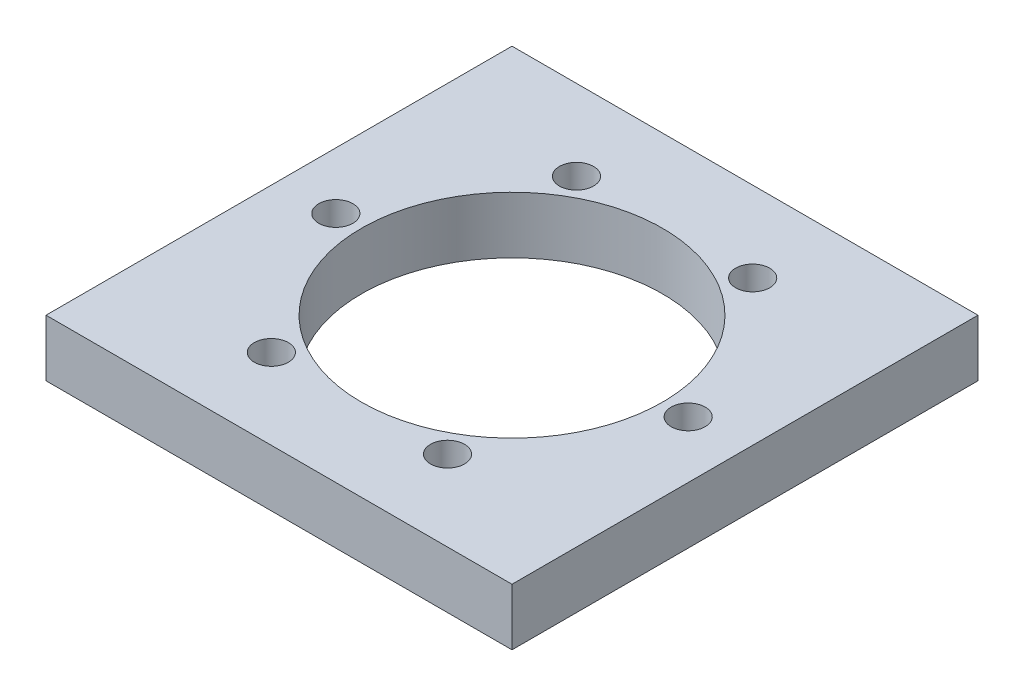
ISO-10303-21;
HEADER;
FILE_DESCRIPTION(('STEP AP214'),'2;1');
FILE_NAME('part.step','',(''),(''),'','','');
FILE_SCHEMA(('AUTOMOTIVE_DESIGN { 1 0 10303 214 1 1 1 1 }'));
ENDSEC;
DATA;
#1=APPLICATION_CONTEXT('core data for automotive mechanical design processes');
#2=APPLICATION_PROTOCOL_DEFINITION('international standard','automotive_design',2000,#1);
#3=PRODUCT_CONTEXT('',#1,'mechanical');
#4=PRODUCT('Part','Part','',(#3));
#5=PRODUCT_RELATED_PRODUCT_CATEGORY('part','',(#4));
#6=PRODUCT_DEFINITION_FORMATION('','',#4);
#7=PRODUCT_DEFINITION_CONTEXT('part definition',#1,'design');
#8=PRODUCT_DEFINITION('design','',#6,#7);
#9=PRODUCT_DEFINITION_SHAPE('','',#8);
#10=(LENGTH_UNIT() NAMED_UNIT(*) SI_UNIT(.MILLI.,.METRE.));
#11=(NAMED_UNIT(*) PLANE_ANGLE_UNIT() SI_UNIT($,.RADIAN.));
#12=(NAMED_UNIT(*) SI_UNIT($,.STERADIAN.) SOLID_ANGLE_UNIT());
#13=UNCERTAINTY_MEASURE_WITH_UNIT(LENGTH_MEASURE(1.E-05),#10,'distance_accuracy_value','');
#14=(GEOMETRIC_REPRESENTATION_CONTEXT(3) GLOBAL_UNCERTAINTY_ASSIGNED_CONTEXT((#13)) GLOBAL_UNIT_ASSIGNED_CONTEXT((#10,
#11,#12)) REPRESENTATION_CONTEXT('',''));
#15=CARTESIAN_POINT('',(0.,0.,0.));
#16=DIRECTION('',(0.,0.,1.));
#17=DIRECTION('',(1.,0.,0.));
#18=AXIS2_PLACEMENT_3D('',#15,#16,#17);
#19=CARTESIAN_POINT('',(0.,5.,0.));
#20=DIRECTION('',(0.,1.,0.));
#21=DIRECTION('',(0.,0.,1.));
#22=AXIS2_PLACEMENT_3D('',#19,#20,#21);
#23=PLANE('',#22);
#24=CARTESIAN_POINT('',(7.75,5.,-13.4233937586588));
#25=DIRECTION('',(0.,1.,0.));
#26=DIRECTION('',(0.,0.,1.));
#27=AXIS2_PLACEMENT_3D('',#24,#25,#26);
#28=CIRCLE('',#27,1.5);
#29=CARTESIAN_POINT('',(7.75,5.,-11.9233937586588));
#30=VERTEX_POINT('',#29);
#31=EDGE_CURVE('E168',#30,#30,#28,.T.);
#32=ORIENTED_EDGE('',*,*,#31,.F.);
#33=EDGE_LOOP('',(#32));
#34=FACE_BOUND('',#33,.T.);
#35=CARTESIAN_POINT('',(-15.5,5.,0.));
#36=DIRECTION('',(0.,1.,0.));
#37=DIRECTION('',(0.,0.,1.));
#38=AXIS2_PLACEMENT_3D('',#35,#36,#37);
#39=CIRCLE('',#38,1.5);
#40=CARTESIAN_POINT('',(-15.5,5.,1.5));
#41=VERTEX_POINT('',#40);
#42=EDGE_CURVE('E152',#41,#41,#39,.T.);
#43=ORIENTED_EDGE('',*,*,#42,.F.);
#44=EDGE_LOOP('',(#43));
#45=FACE_BOUND('',#44,.T.);
#46=CARTESIAN_POINT('',(7.75,5.,13.4233937586588));
#47=DIRECTION('',(0.,1.,0.));
#48=DIRECTION('',(0.,0.,1.));
#49=AXIS2_PLACEMENT_3D('',#46,#47,#48);
#50=CIRCLE('',#49,1.5);
#51=CARTESIAN_POINT('',(7.75,5.,14.9233937586588));
#52=VERTEX_POINT('',#51);
#53=EDGE_CURVE('E136',#52,#52,#50,.T.);
#54=ORIENTED_EDGE('',*,*,#53,.F.);
#55=EDGE_LOOP('',(#54));
#56=FACE_BOUND('',#55,.T.);
#57=DIRECTION('',(0.,0.,-1.));
#58=VECTOR('',#57,1.);
#59=CARTESIAN_POINT('',(20.5,5.,-20.5));
#60=LINE('',#59,#58);
#61=CARTESIAN_POINT('',(20.5,5.,20.5));
#62=VERTEX_POINT('',#61);
#63=CARTESIAN_POINT('',(20.5,5.,-20.5));
#64=VERTEX_POINT('',#63);
#65=EDGE_CURVE('E94',#62,#64,#60,.T.);
#66=ORIENTED_EDGE('',*,*,#65,.T.);
#67=DIRECTION('',(-1.,0.,0.));
#68=VECTOR('',#67,1.);
#69=CARTESIAN_POINT('',(-20.5,5.,-20.5));
#70=LINE('',#69,#68);
#71=CARTESIAN_POINT('',(-20.5,5.,-20.5));
#72=VERTEX_POINT('',#71);
#73=EDGE_CURVE('E89',#64,#72,#70,.T.);
#74=ORIENTED_EDGE('',*,*,#73,.T.);
#75=DIRECTION('',(0.,0.,1.));
#76=VECTOR('',#75,1.);
#77=CARTESIAN_POINT('',(-20.5,5.,-20.5));
#78=LINE('',#77,#76);
#79=CARTESIAN_POINT('',(-20.5,5.,20.5));
#80=VERTEX_POINT('',#79);
#81=EDGE_CURVE('E92',#72,#80,#78,.T.);
#82=ORIENTED_EDGE('',*,*,#81,.T.);
#83=DIRECTION('',(1.,0.,0.));
#84=VECTOR('',#83,1.);
#85=CARTESIAN_POINT('',(-20.5,5.,20.5));
#86=LINE('',#85,#84);
#87=EDGE_CURVE('E59',#80,#62,#86,.T.);
#88=ORIENTED_EDGE('',*,*,#87,.T.);
#89=EDGE_LOOP('',(#66,#74,#82,#88));
#90=FACE_BOUND('',#89,.T.);
#91=CARTESIAN_POINT('',(15.5,5.,0.));
#92=DIRECTION('',(0.,1.,0.));
#93=DIRECTION('',(0.,0.,1.));
#94=AXIS2_PLACEMENT_3D('',#91,#92,#93);
#95=CIRCLE('',#94,1.5);
#96=CARTESIAN_POINT('',(15.5,5.,1.5));
#97=VERTEX_POINT('',#96);
#98=EDGE_CURVE('E114',#97,#97,#95,.T.);
#99=ORIENTED_EDGE('',*,*,#98,.F.);
#100=EDGE_LOOP('',(#99));
#101=FACE_BOUND('',#100,.T.);
#102=CARTESIAN_POINT('',(-7.75,5.,13.4233937586588));
#103=DIRECTION('',(0.,1.,0.));
#104=DIRECTION('',(0.,0.,1.));
#105=AXIS2_PLACEMENT_3D('',#102,#103,#104);
#106=CIRCLE('',#105,1.5);
#107=CARTESIAN_POINT('',(-7.75,5.,14.9233937586588));
#108=VERTEX_POINT('',#107);
#109=EDGE_CURVE('E144',#108,#108,#106,.T.);
#110=ORIENTED_EDGE('',*,*,#109,.F.);
#111=EDGE_LOOP('',(#110));
#112=FACE_BOUND('',#111,.T.);
#113=CARTESIAN_POINT('',(-7.75,5.,-13.4233937586588));
#114=DIRECTION('',(0.,1.,0.));
#115=DIRECTION('',(0.,0.,1.));
#116=AXIS2_PLACEMENT_3D('',#113,#114,#115);
#117=CIRCLE('',#116,1.5);
#118=CARTESIAN_POINT('',(-7.75,5.,-11.9233937586588));
#119=VERTEX_POINT('',#118);
#120=EDGE_CURVE('E160',#119,#119,#117,.T.);
#121=ORIENTED_EDGE('',*,*,#120,.F.);
#122=EDGE_LOOP('',(#121));
#123=FACE_BOUND('',#122,.T.);
#124=CARTESIAN_POINT('',(0.,5.,0.));
#125=DIRECTION('',(0.,1.,0.));
#126=DIRECTION('',(0.,0.,1.));
#127=AXIS2_PLACEMENT_3D('',#124,#125,#126);
#128=CIRCLE('',#127,13.25);
#129=CARTESIAN_POINT('',(0.,5.,13.25));
#130=VERTEX_POINT('',#129);
#131=EDGE_CURVE('E176',#130,#130,#128,.T.);
#132=ORIENTED_EDGE('',*,*,#131,.F.);
#133=EDGE_LOOP('',(#132));
#134=FACE_BOUND('',#133,.T.);
#135=ADVANCED_FACE('F41',(#34,#45,#56,#90,#101,#112,#123,#134),#23,.T.);
#136=CARTESIAN_POINT('',(0.,0.,0.));
#137=DIRECTION('',(0.,1.,0.));
#138=DIRECTION('',(0.,0.,1.));
#139=AXIS2_PLACEMENT_3D('',#136,#137,#138);
#140=PLANE('',#139);
#141=DIRECTION('',(0.,0.,-1.));
#142=VECTOR('',#141,1.);
#143=CARTESIAN_POINT('',(20.5,0.,-20.5));
#144=LINE('',#143,#142);
#145=CARTESIAN_POINT('',(20.5,0.,20.5));
#146=VERTEX_POINT('',#145);
#147=CARTESIAN_POINT('',(20.5,0.,-20.5));
#148=VERTEX_POINT('',#147);
#149=EDGE_CURVE('E110',#146,#148,#144,.T.);
#150=ORIENTED_EDGE('',*,*,#149,.F.);
#151=DIRECTION('',(1.,0.,0.));
#152=VECTOR('',#151,1.);
#153=CARTESIAN_POINT('',(-20.5,0.,20.5));
#154=LINE('',#153,#152);
#155=CARTESIAN_POINT('',(-20.5,0.,20.5));
#156=VERTEX_POINT('',#155);
#157=EDGE_CURVE('E82',#156,#146,#154,.T.);
#158=ORIENTED_EDGE('',*,*,#157,.F.);
#159=DIRECTION('',(0.,0.,1.));
#160=VECTOR('',#159,1.);
#161=CARTESIAN_POINT('',(-20.5,0.,-20.5));
#162=LINE('',#161,#160);
#163=CARTESIAN_POINT('',(-20.5,0.,-20.5));
#164=VERTEX_POINT('',#163);
#165=EDGE_CURVE('E76',#164,#156,#162,.T.);
#166=ORIENTED_EDGE('',*,*,#165,.F.);
#167=DIRECTION('',(-1.,0.,0.));
#168=VECTOR('',#167,1.);
#169=CARTESIAN_POINT('',(-20.5,0.,-20.5));
#170=LINE('',#169,#168);
#171=EDGE_CURVE('E99',#148,#164,#170,.T.);
#172=ORIENTED_EDGE('',*,*,#171,.F.);
#173=EDGE_LOOP('',(#150,#158,#166,#172));
#174=FACE_BOUND('',#173,.T.);
#175=CARTESIAN_POINT('',(15.5,0.,0.));
#176=DIRECTION('',(0.,1.,0.));
#177=DIRECTION('',(0.,0.,1.));
#178=AXIS2_PLACEMENT_3D('',#175,#176,#177);
#179=CIRCLE('',#178,1.5);
#180=CARTESIAN_POINT('',(15.5,0.,1.5));
#181=VERTEX_POINT('',#180);
#182=EDGE_CURVE('E132',#181,#181,#179,.T.);
#183=ORIENTED_EDGE('',*,*,#182,.T.);
#184=EDGE_LOOP('',(#183));
#185=FACE_BOUND('',#184,.T.);
#186=CARTESIAN_POINT('',(7.75,0.,13.4233937586588));
#187=DIRECTION('',(0.,1.,0.));
#188=DIRECTION('',(0.,0.,1.));
#189=AXIS2_PLACEMENT_3D('',#186,#187,#188);
#190=CIRCLE('',#189,1.5);
#191=CARTESIAN_POINT('',(7.75,0.,14.9233937586588));
#192=VERTEX_POINT('',#191);
#193=EDGE_CURVE('E140',#192,#192,#190,.T.);
#194=ORIENTED_EDGE('',*,*,#193,.T.);
#195=EDGE_LOOP('',(#194));
#196=FACE_BOUND('',#195,.T.);
#197=CARTESIAN_POINT('',(-7.75,0.,13.4233937586588));
#198=DIRECTION('',(0.,1.,0.));
#199=DIRECTION('',(0.,0.,1.));
#200=AXIS2_PLACEMENT_3D('',#197,#198,#199);
#201=CIRCLE('',#200,1.5);
#202=CARTESIAN_POINT('',(-7.75,0.,14.9233937586588));
#203=VERTEX_POINT('',#202);
#204=EDGE_CURVE('E148',#203,#203,#201,.T.);
#205=ORIENTED_EDGE('',*,*,#204,.T.);
#206=EDGE_LOOP('',(#205));
#207=FACE_BOUND('',#206,.T.);
#208=CARTESIAN_POINT('',(-15.5,0.,0.));
#209=DIRECTION('',(0.,1.,0.));
#210=DIRECTION('',(0.,0.,1.));
#211=AXIS2_PLACEMENT_3D('',#208,#209,#210);
#212=CIRCLE('',#211,1.5);
#213=CARTESIAN_POINT('',(-15.5,0.,1.5));
#214=VERTEX_POINT('',#213);
#215=EDGE_CURVE('E156',#214,#214,#212,.T.);
#216=ORIENTED_EDGE('',*,*,#215,.T.);
#217=EDGE_LOOP('',(#216));
#218=FACE_BOUND('',#217,.T.);
#219=CARTESIAN_POINT('',(-7.75,0.,-13.4233937586588));
#220=DIRECTION('',(0.,1.,0.));
#221=DIRECTION('',(0.,0.,1.));
#222=AXIS2_PLACEMENT_3D('',#219,#220,#221);
#223=CIRCLE('',#222,1.5);
#224=CARTESIAN_POINT('',(-7.75,0.,-11.9233937586588));
#225=VERTEX_POINT('',#224);
#226=EDGE_CURVE('E164',#225,#225,#223,.T.);
#227=ORIENTED_EDGE('',*,*,#226,.T.);
#228=EDGE_LOOP('',(#227));
#229=FACE_BOUND('',#228,.T.);
#230=CARTESIAN_POINT('',(7.75,0.,-13.4233937586588));
#231=DIRECTION('',(0.,1.,0.));
#232=DIRECTION('',(0.,0.,1.));
#233=AXIS2_PLACEMENT_3D('',#230,#231,#232);
#234=CIRCLE('',#233,1.5);
#235=CARTESIAN_POINT('',(7.75,0.,-11.9233937586588));
#236=VERTEX_POINT('',#235);
#237=EDGE_CURVE('E172',#236,#236,#234,.T.);
#238=ORIENTED_EDGE('',*,*,#237,.T.);
#239=EDGE_LOOP('',(#238));
#240=FACE_BOUND('',#239,.T.);
#241=CARTESIAN_POINT('',(0.,0.,0.));
#242=DIRECTION('',(0.,1.,0.));
#243=DIRECTION('',(0.,0.,1.));
#244=AXIS2_PLACEMENT_3D('',#241,#242,#243);
#245=CIRCLE('',#244,13.25);
#246=CARTESIAN_POINT('',(0.,0.,13.25));
#247=VERTEX_POINT('',#246);
#248=EDGE_CURVE('E180',#247,#247,#245,.T.);
#249=ORIENTED_EDGE('',*,*,#248,.T.);
#250=EDGE_LOOP('',(#249));
#251=FACE_BOUND('',#250,.T.);
#252=ADVANCED_FACE('F127',(#174,#185,#196,#207,#218,#229,#240,#251),#140,.F.);
#253=CARTESIAN_POINT('',(20.5,5.,-20.5));
#254=DIRECTION('',(-1.,0.,0.));
#255=DIRECTION('',(0.,0.,1.));
#256=AXIS2_PLACEMENT_3D('',#253,#254,#255);
#257=PLANE('',#256);
#258=ORIENTED_EDGE('',*,*,#149,.T.);
#259=DIRECTION('',(0.,-1.,0.));
#260=VECTOR('',#259,1.);
#261=CARTESIAN_POINT('',(20.5,5.,-20.5));
#262=LINE('',#261,#260);
#263=EDGE_CURVE('E11',#64,#148,#262,.T.);
#264=ORIENTED_EDGE('',*,*,#263,.F.);
#265=ORIENTED_EDGE('',*,*,#65,.F.);
#266=DIRECTION('',(0.,-1.,0.));
#267=VECTOR('',#266,1.);
#268=CARTESIAN_POINT('',(20.5,5.,20.5));
#269=LINE('',#268,#267);
#270=EDGE_CURVE('E106',#62,#146,#269,.T.);
#271=ORIENTED_EDGE('',*,*,#270,.T.);
#272=EDGE_LOOP('',(#258,#264,#265,#271));
#273=FACE_BOUND('',#272,.T.);
#274=ADVANCED_FACE('F43',(#273),#257,.F.);
#275=CARTESIAN_POINT('',(-20.5,5.,-20.5));
#276=DIRECTION('',(0.,0.,1.));
#277=DIRECTION('',(1.,0.,0.));
#278=AXIS2_PLACEMENT_3D('',#275,#276,#277);
#279=PLANE('',#278);
#280=ORIENTED_EDGE('',*,*,#171,.T.);
#281=DIRECTION('',(0.,-1.,0.));
#282=VECTOR('',#281,1.);
#283=CARTESIAN_POINT('',(-20.5,5.,-20.5));
#284=LINE('',#283,#282);
#285=EDGE_CURVE('E51',#72,#164,#284,.T.);
#286=ORIENTED_EDGE('',*,*,#285,.F.);
#287=ORIENTED_EDGE('',*,*,#73,.F.);
#288=ORIENTED_EDGE('',*,*,#263,.T.);
#289=EDGE_LOOP('',(#280,#286,#287,#288));
#290=FACE_BOUND('',#289,.T.);
#291=ADVANCED_FACE('F98',(#290),#279,.F.);
#292=CARTESIAN_POINT('',(-20.5,5.,-20.5));
#293=DIRECTION('',(1.,0.,0.));
#294=DIRECTION('',(0.,0.,-1.));
#295=AXIS2_PLACEMENT_3D('',#292,#293,#294);
#296=PLANE('',#295);
#297=ORIENTED_EDGE('',*,*,#165,.T.);
#298=DIRECTION('',(0.,-1.,0.));
#299=VECTOR('',#298,1.);
#300=CARTESIAN_POINT('',(-20.5,5.,20.5));
#301=LINE('',#300,#299);
#302=EDGE_CURVE('E101',#80,#156,#301,.T.);
#303=ORIENTED_EDGE('',*,*,#302,.F.);
#304=ORIENTED_EDGE('',*,*,#81,.F.);
#305=ORIENTED_EDGE('',*,*,#285,.T.);
#306=EDGE_LOOP('',(#297,#303,#304,#305));
#307=FACE_BOUND('',#306,.T.);
#308=ADVANCED_FACE('F102',(#307),#296,.F.);
#309=CARTESIAN_POINT('',(-20.5,5.,20.5));
#310=DIRECTION('',(0.,0.,-1.));
#311=DIRECTION('',(-1.,0.,0.));
#312=AXIS2_PLACEMENT_3D('',#309,#310,#311);
#313=PLANE('',#312);
#314=ORIENTED_EDGE('',*,*,#157,.T.);
#315=ORIENTED_EDGE('',*,*,#270,.F.);
#316=ORIENTED_EDGE('',*,*,#87,.F.);
#317=ORIENTED_EDGE('',*,*,#302,.T.);
#318=EDGE_LOOP('',(#314,#315,#316,#317));
#319=FACE_BOUND('',#318,.T.);
#320=ADVANCED_FACE('F124',(#319),#313,.F.);
#321=CARTESIAN_POINT('',(15.5,5.,0.));
#322=DIRECTION('',(0.,-1.,0.));
#323=DIRECTION('',(0.,0.,-1.));
#324=AXIS2_PLACEMENT_3D('',#321,#322,#323);
#325=CYLINDRICAL_SURFACE('',#324,1.5);
#326=ORIENTED_EDGE('',*,*,#98,.T.);
#327=EDGE_LOOP('',(#326));
#328=FACE_BOUND('',#327,.T.);
#329=ORIENTED_EDGE('',*,*,#182,.F.);
#330=EDGE_LOOP('',(#329));
#331=FACE_BOUND('',#330,.T.);
#332=ADVANCED_FACE('F201',(#328,#331),#325,.F.);
#333=CARTESIAN_POINT('',(7.75,5.,13.4233937586588));
#334=DIRECTION('',(0.,-1.,0.));
#335=DIRECTION('',(0.,0.,-1.));
#336=AXIS2_PLACEMENT_3D('',#333,#334,#335);
#337=CYLINDRICAL_SURFACE('',#336,1.5);
#338=ORIENTED_EDGE('',*,*,#53,.T.);
#339=EDGE_LOOP('',(#338));
#340=FACE_BOUND('',#339,.T.);
#341=ORIENTED_EDGE('',*,*,#193,.F.);
#342=EDGE_LOOP('',(#341));
#343=FACE_BOUND('',#342,.T.);
#344=ADVANCED_FACE('F247',(#340,#343),#337,.F.);
#345=CARTESIAN_POINT('',(-7.75,5.,13.4233937586588));
#346=DIRECTION('',(0.,-1.,0.));
#347=DIRECTION('',(0.,0.,-1.));
#348=AXIS2_PLACEMENT_3D('',#345,#346,#347);
#349=CYLINDRICAL_SURFACE('',#348,1.5);
#350=ORIENTED_EDGE('',*,*,#109,.T.);
#351=EDGE_LOOP('',(#350));
#352=FACE_BOUND('',#351,.T.);
#353=ORIENTED_EDGE('',*,*,#204,.F.);
#354=EDGE_LOOP('',(#353));
#355=FACE_BOUND('',#354,.T.);
#356=ADVANCED_FACE('F255',(#352,#355),#349,.F.);
#357=CARTESIAN_POINT('',(-15.5,5.,0.));
#358=DIRECTION('',(0.,-1.,0.));
#359=DIRECTION('',(0.,0.,-1.));
#360=AXIS2_PLACEMENT_3D('',#357,#358,#359);
#361=CYLINDRICAL_SURFACE('',#360,1.5);
#362=ORIENTED_EDGE('',*,*,#42,.T.);
#363=EDGE_LOOP('',(#362));
#364=FACE_BOUND('',#363,.T.);
#365=ORIENTED_EDGE('',*,*,#215,.F.);
#366=EDGE_LOOP('',(#365));
#367=FACE_BOUND('',#366,.T.);
#368=ADVANCED_FACE('F263',(#364,#367),#361,.F.);
#369=CARTESIAN_POINT('',(-7.75,5.,-13.4233937586588));
#370=DIRECTION('',(0.,-1.,0.));
#371=DIRECTION('',(0.,0.,-1.));
#372=AXIS2_PLACEMENT_3D('',#369,#370,#371);
#373=CYLINDRICAL_SURFACE('',#372,1.5);
#374=ORIENTED_EDGE('',*,*,#120,.T.);
#375=EDGE_LOOP('',(#374));
#376=FACE_BOUND('',#375,.T.);
#377=ORIENTED_EDGE('',*,*,#226,.F.);
#378=EDGE_LOOP('',(#377));
#379=FACE_BOUND('',#378,.T.);
#380=ADVANCED_FACE('F272',(#376,#379),#373,.F.);
#381=CARTESIAN_POINT('',(7.75,5.,-13.4233937586588));
#382=DIRECTION('',(0.,-1.,0.));
#383=DIRECTION('',(0.,0.,-1.));
#384=AXIS2_PLACEMENT_3D('',#381,#382,#383);
#385=CYLINDRICAL_SURFACE('',#384,1.5);
#386=ORIENTED_EDGE('',*,*,#31,.T.);
#387=EDGE_LOOP('',(#386));
#388=FACE_BOUND('',#387,.T.);
#389=ORIENTED_EDGE('',*,*,#237,.F.);
#390=EDGE_LOOP('',(#389));
#391=FACE_BOUND('',#390,.T.);
#392=ADVANCED_FACE('F281',(#388,#391),#385,.F.);
#393=CARTESIAN_POINT('',(0.,5.,0.));
#394=DIRECTION('',(0.,-1.,0.));
#395=DIRECTION('',(0.,0.,-1.));
#396=AXIS2_PLACEMENT_3D('',#393,#394,#395);
#397=CYLINDRICAL_SURFACE('',#396,13.25);
#398=ORIENTED_EDGE('',*,*,#131,.T.);
#399=EDGE_LOOP('',(#398));
#400=FACE_BOUND('',#399,.T.);
#401=ORIENTED_EDGE('',*,*,#248,.F.);
#402=EDGE_LOOP('',(#401));
#403=FACE_BOUND('',#402,.T.);
#404=ADVANCED_FACE('F188',(#400,#403),#397,.F.);
#405=CLOSED_SHELL('',(#135,#252,#274,#291,#308,#320,#332,#344,#356,#368,#380,#392,#404));
#406=MANIFOLD_SOLID_BREP('B2',#405);
#407=ADVANCED_BREP_SHAPE_REPRESENTATION('',(#18,#406),#14);
#408=SHAPE_DEFINITION_REPRESENTATION(#9,#407);
ENDSEC;
END-ISO-10303-21;
